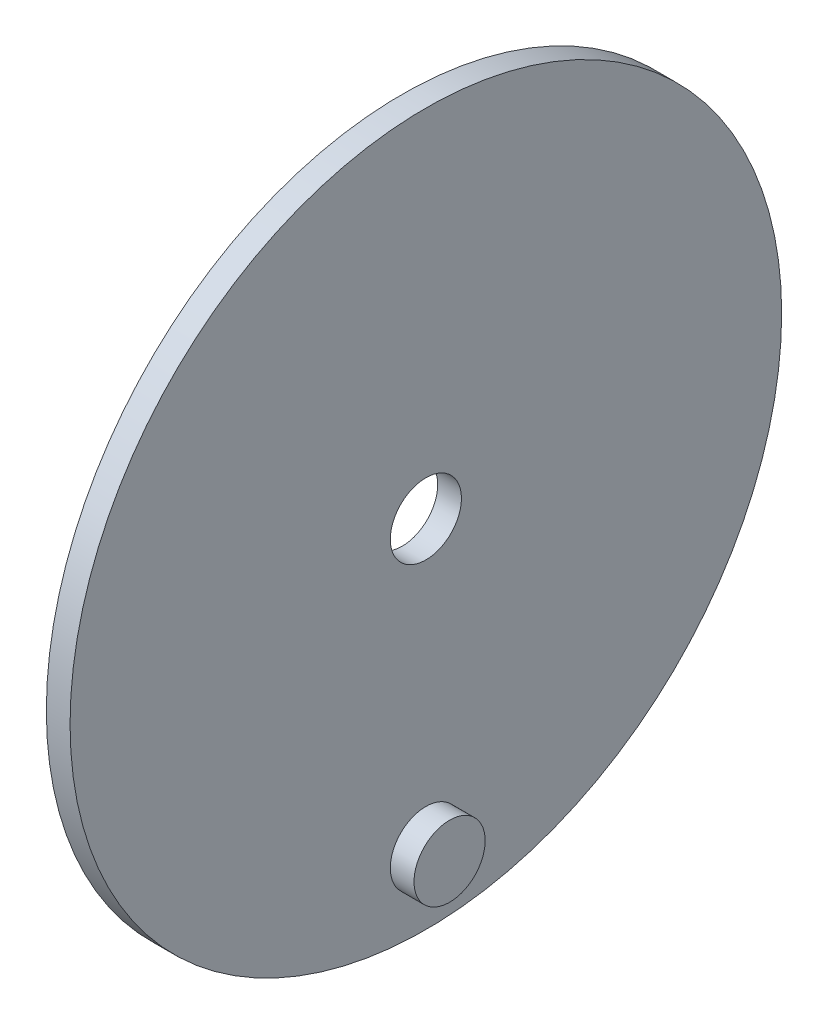
ISO-10303-21;
HEADER;
FILE_DESCRIPTION(('STEP AP214'),'2;1');
FILE_NAME('part.step','',(''),(''),'','','');
FILE_SCHEMA(('AUTOMOTIVE_DESIGN { 1 0 10303 214 1 1 1 1 }'));
ENDSEC;
DATA;
#1=APPLICATION_CONTEXT('core data for automotive mechanical design processes');
#2=APPLICATION_PROTOCOL_DEFINITION('international standard','automotive_design',2000,#1);
#3=PRODUCT_CONTEXT('',#1,'mechanical');
#4=PRODUCT('Part','Part','',(#3));
#5=PRODUCT_RELATED_PRODUCT_CATEGORY('part','',(#4));
#6=PRODUCT_DEFINITION_FORMATION('','',#4);
#7=PRODUCT_DEFINITION_CONTEXT('part definition',#1,'design');
#8=PRODUCT_DEFINITION('design','',#6,#7);
#9=PRODUCT_DEFINITION_SHAPE('','',#8);
#10=(LENGTH_UNIT() NAMED_UNIT(*) SI_UNIT(.MILLI.,.METRE.));
#11=(NAMED_UNIT(*) PLANE_ANGLE_UNIT() SI_UNIT($,.RADIAN.));
#12=(NAMED_UNIT(*) SI_UNIT($,.STERADIAN.) SOLID_ANGLE_UNIT());
#13=UNCERTAINTY_MEASURE_WITH_UNIT(LENGTH_MEASURE(1.E-05),#10,'distance_accuracy_value','');
#14=(GEOMETRIC_REPRESENTATION_CONTEXT(3) GLOBAL_UNCERTAINTY_ASSIGNED_CONTEXT((#13)) GLOBAL_UNIT_ASSIGNED_CONTEXT((#10,
#11,#12)) REPRESENTATION_CONTEXT('',''));
#15=CARTESIAN_POINT('',(0.,0.,0.));
#16=DIRECTION('',(0.,0.,1.));
#17=DIRECTION('',(1.,0.,0.));
#18=AXIS2_PLACEMENT_3D('',#15,#16,#17);
#19=CARTESIAN_POINT('',(10.,0.,0.));
#20=DIRECTION('',(1.,0.,0.));
#21=DIRECTION('',(0.,0.,-1.));
#22=AXIS2_PLACEMENT_3D('',#19,#20,#21);
#23=PLANE('',#22);
#24=CARTESIAN_POINT('',(10.,-120.,0.));
#25=DIRECTION('',(1.,0.,0.));
#26=DIRECTION('',(0.,0.,-1.));
#27=AXIS2_PLACEMENT_3D('',#24,#25,#26);
#28=CIRCLE('',#27,15.);
#29=CARTESIAN_POINT('',(10.,-120.,-15.));
#30=VERTEX_POINT('',#29);
#31=EDGE_CURVE('E51',#30,#30,#28,.T.);
#32=ORIENTED_EDGE('',*,*,#31,.F.);
#33=EDGE_LOOP('',(#32));
#34=FACE_BOUND('',#33,.T.);
#35=CARTESIAN_POINT('',(10.,0.,0.));
#36=DIRECTION('',(1.,0.,0.));
#37=DIRECTION('',(0.,0.,-1.));
#38=AXIS2_PLACEMENT_3D('',#35,#36,#37);
#39=CIRCLE('',#38,150.);
#40=CARTESIAN_POINT('',(10.,0.,-150.));
#41=VERTEX_POINT('',#40);
#42=EDGE_CURVE('E10',#41,#41,#39,.T.);
#43=ORIENTED_EDGE('',*,*,#42,.T.);
#44=EDGE_LOOP('',(#43));
#45=FACE_BOUND('',#44,.T.);
#46=CARTESIAN_POINT('',(10.,0.,0.));
#47=DIRECTION('',(1.,0.,0.));
#48=DIRECTION('',(0.,0.,-1.));
#49=AXIS2_PLACEMENT_3D('',#46,#47,#48);
#50=CIRCLE('',#49,15.);
#51=CARTESIAN_POINT('',(10.,0.,-15.));
#52=VERTEX_POINT('',#51);
#53=EDGE_CURVE('E43',#52,#52,#50,.T.);
#54=ORIENTED_EDGE('',*,*,#53,.F.);
#55=EDGE_LOOP('',(#54));
#56=FACE_BOUND('',#55,.T.);
#57=ADVANCED_FACE('F32',(#34,#45,#56),#23,.T.);
#58=CARTESIAN_POINT('',(0.,0.,0.));
#59=DIRECTION('',(1.,0.,0.));
#60=DIRECTION('',(0.,0.,-1.));
#61=AXIS2_PLACEMENT_3D('',#58,#59,#60);
#62=PLANE('',#61);
#63=CARTESIAN_POINT('',(0.,0.,0.));
#64=DIRECTION('',(1.,0.,0.));
#65=DIRECTION('',(0.,0.,-1.));
#66=AXIS2_PLACEMENT_3D('',#63,#64,#65);
#67=CIRCLE('',#66,150.);
#68=CARTESIAN_POINT('',(0.,0.,-150.));
#69=VERTEX_POINT('',#68);
#70=EDGE_CURVE('E36',#69,#69,#67,.T.);
#71=ORIENTED_EDGE('',*,*,#70,.F.);
#72=EDGE_LOOP('',(#71));
#73=FACE_BOUND('',#72,.T.);
#74=CARTESIAN_POINT('',(0.,0.,0.));
#75=DIRECTION('',(1.,0.,0.));
#76=DIRECTION('',(0.,0.,-1.));
#77=AXIS2_PLACEMENT_3D('',#74,#75,#76);
#78=CIRCLE('',#77,15.);
#79=CARTESIAN_POINT('',(0.,0.,-15.));
#80=VERTEX_POINT('',#79);
#81=EDGE_CURVE('E45',#80,#80,#78,.T.);
#82=ORIENTED_EDGE('',*,*,#81,.T.);
#83=EDGE_LOOP('',(#82));
#84=FACE_BOUND('',#83,.T.);
#85=ADVANCED_FACE('F67',(#73,#84),#62,.F.);
#86=CARTESIAN_POINT('',(10.,0.,0.));
#87=DIRECTION('',(-1.,0.,0.));
#88=DIRECTION('',(0.,0.,1.));
#89=AXIS2_PLACEMENT_3D('',#86,#87,#88);
#90=CYLINDRICAL_SURFACE('',#89,150.);
#91=ORIENTED_EDGE('',*,*,#42,.F.);
#92=EDGE_LOOP('',(#91));
#93=FACE_BOUND('',#92,.T.);
#94=ORIENTED_EDGE('',*,*,#70,.T.);
#95=EDGE_LOOP('',(#94));
#96=FACE_BOUND('',#95,.T.);
#97=ADVANCED_FACE('F34',(#93,#96),#90,.T.);
#98=CARTESIAN_POINT('',(10.,0.,0.));
#99=DIRECTION('',(-1.,0.,0.));
#100=DIRECTION('',(0.,0.,1.));
#101=AXIS2_PLACEMENT_3D('',#98,#99,#100);
#102=CYLINDRICAL_SURFACE('',#101,15.);
#103=ORIENTED_EDGE('',*,*,#53,.T.);
#104=EDGE_LOOP('',(#103));
#105=FACE_BOUND('',#104,.T.);
#106=ORIENTED_EDGE('',*,*,#81,.F.);
#107=EDGE_LOOP('',(#106));
#108=FACE_BOUND('',#107,.T.);
#109=ADVANCED_FACE('F62',(#105,#108),#102,.F.);
#110=CARTESIAN_POINT('',(20.,-120.,0.));
#111=DIRECTION('',(-1.,0.,0.));
#112=DIRECTION('',(0.,0.,1.));
#113=AXIS2_PLACEMENT_3D('',#110,#111,#112);
#114=CYLINDRICAL_SURFACE('',#113,15.);
#115=CARTESIAN_POINT('',(20.,-120.,0.));
#116=DIRECTION('',(1.,0.,0.));
#117=DIRECTION('',(0.,0.,-1.));
#118=AXIS2_PLACEMENT_3D('',#115,#116,#117);
#119=CIRCLE('',#118,15.);
#120=CARTESIAN_POINT('',(20.,-120.,-15.));
#121=VERTEX_POINT('',#120);
#122=EDGE_CURVE('E48',#121,#121,#119,.T.);
#123=ORIENTED_EDGE('',*,*,#122,.F.);
#124=EDGE_LOOP('',(#123));
#125=FACE_BOUND('',#124,.T.);
#126=ORIENTED_EDGE('',*,*,#31,.T.);
#127=EDGE_LOOP('',(#126));
#128=FACE_BOUND('',#127,.T.);
#129=ADVANCED_FACE('F59',(#125,#128),#114,.T.);
#130=CARTESIAN_POINT('',(20.,-120.,0.));
#131=DIRECTION('',(1.,0.,0.));
#132=DIRECTION('',(0.,0.,-1.));
#133=AXIS2_PLACEMENT_3D('',#130,#131,#132);
#134=PLANE('',#133);
#135=ORIENTED_EDGE('',*,*,#122,.T.);
#136=EDGE_LOOP('',(#135));
#137=FACE_BOUND('',#136,.T.);
#138=ADVANCED_FACE('F57',(#137),#134,.T.);
#139=CLOSED_SHELL('',(#57,#85,#97,#109,#129,#138));
#140=MANIFOLD_SOLID_BREP('B2',#139);
#141=ADVANCED_BREP_SHAPE_REPRESENTATION('',(#18,#140),#14);
#142=SHAPE_DEFINITION_REPRESENTATION(#9,#141);
ENDSEC;
END-ISO-10303-21;
